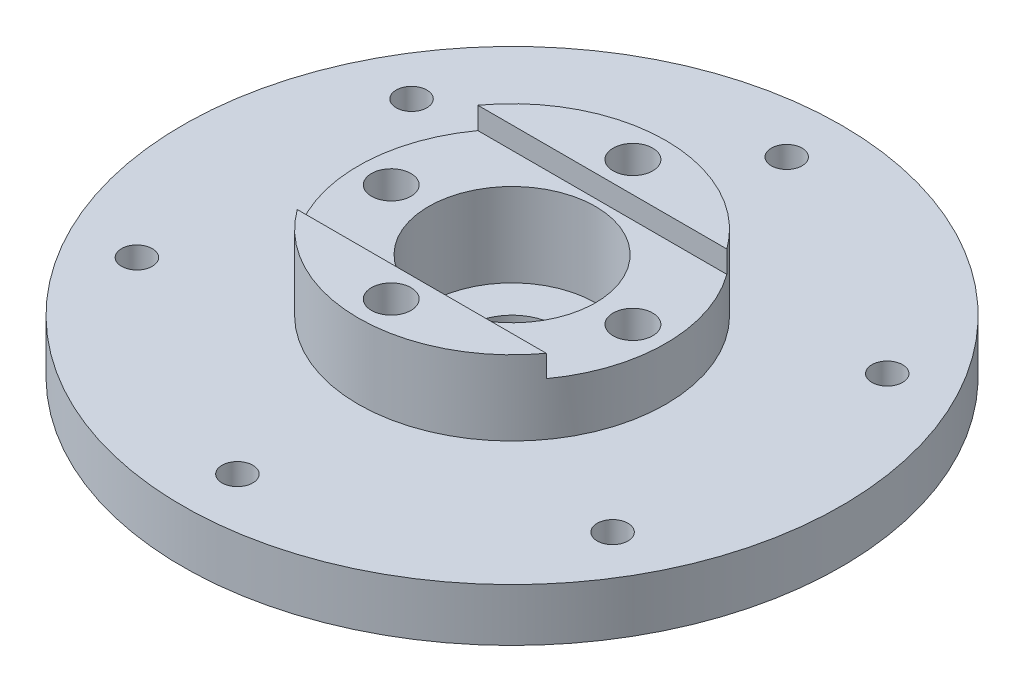
ISO-10303-21;
HEADER;
FILE_DESCRIPTION(('STEP AP214'),'2;1');
FILE_NAME('part.step','',(''),(''),'','','');
FILE_SCHEMA(('AUTOMOTIVE_DESIGN { 1 0 10303 214 1 1 1 1 }'));
ENDSEC;
DATA;
#1=APPLICATION_CONTEXT('core data for automotive mechanical design processes');
#2=APPLICATION_PROTOCOL_DEFINITION('international standard','automotive_design',2000,#1);
#3=PRODUCT_CONTEXT('',#1,'mechanical');
#4=PRODUCT('Part','Part','',(#3));
#5=PRODUCT_RELATED_PRODUCT_CATEGORY('part','',(#4));
#6=PRODUCT_DEFINITION_FORMATION('','',#4);
#7=PRODUCT_DEFINITION_CONTEXT('part definition',#1,'design');
#8=PRODUCT_DEFINITION('design','',#6,#7);
#9=PRODUCT_DEFINITION_SHAPE('','',#8);
#10=(LENGTH_UNIT() NAMED_UNIT(*) SI_UNIT(.MILLI.,.METRE.));
#11=(NAMED_UNIT(*) PLANE_ANGLE_UNIT() SI_UNIT($,.RADIAN.));
#12=(NAMED_UNIT(*) SI_UNIT($,.STERADIAN.) SOLID_ANGLE_UNIT());
#13=UNCERTAINTY_MEASURE_WITH_UNIT(LENGTH_MEASURE(1.E-05),#10,'distance_accuracy_value','');
#14=(GEOMETRIC_REPRESENTATION_CONTEXT(3) GLOBAL_UNCERTAINTY_ASSIGNED_CONTEXT((#13)) GLOBAL_UNIT_ASSIGNED_CONTEXT((#10,
#11,#12)) REPRESENTATION_CONTEXT('',''));
#15=CARTESIAN_POINT('',(0.,0.,0.));
#16=DIRECTION('',(0.,0.,1.));
#17=DIRECTION('',(1.,0.,0.));
#18=AXIS2_PLACEMENT_3D('',#15,#16,#17);
#19=CARTESIAN_POINT('',(-35.,29.,0.));
#20=DIRECTION('',(0.,-1.,0.));
#21=DIRECTION('',(0.,0.,-1.));
#22=AXIS2_PLACEMENT_3D('',#19,#20,#21);
#23=PLANE('',#22);
#24=CARTESIAN_POINT('',(0.,29.,-27.5));
#25=DIRECTION('',(0.,-1.,0.));
#26=DIRECTION('',(0.,0.,-1.));
#27=AXIS2_PLACEMENT_3D('',#24,#25,#26);
#28=CIRCLE('',#27,4.5);
#29=CARTESIAN_POINT('',(0.,29.,-32.));
#30=VERTEX_POINT('',#29);
#31=EDGE_CURVE('E132',#30,#30,#28,.T.);
#32=ORIENTED_EDGE('',*,*,#31,.T.);
#33=EDGE_LOOP('',(#32));
#34=FACE_BOUND('',#33,.T.);
#35=CARTESIAN_POINT('',(0.,29.,0.));
#36=DIRECTION('',(0.,-1.,0.));
#37=DIRECTION('',(0.,0.,-1.));
#38=AXIS2_PLACEMENT_3D('',#35,#36,#37);
#39=CIRCLE('',#38,35.);
#40=CARTESIAN_POINT('',(-28.3319166312482,29.,-20.55));
#41=VERTEX_POINT('',#40);
#42=CARTESIAN_POINT('',(28.3319166312482,29.,-20.55));
#43=VERTEX_POINT('',#42);
#44=EDGE_CURVE('E92',#41,#43,#39,.T.);
#45=ORIENTED_EDGE('',*,*,#44,.F.);
#46=DIRECTION('',(1.,0.,0.));
#47=VECTOR('',#46,1.);
#48=CARTESIAN_POINT('',(-60.,29.,-20.55));
#49=LINE('',#48,#47);
#50=EDGE_CURVE('E80',#41,#43,#49,.T.);
#51=ORIENTED_EDGE('',*,*,#50,.T.);
#52=EDGE_LOOP('',(#45,#51));
#53=FACE_BOUND('',#52,.T.);
#54=ADVANCED_FACE('F36',(#34,#53),#23,.F.);
#55=CARTESIAN_POINT('',(0.,0.,0.));
#56=DIRECTION('',(0.,-1.,0.));
#57=DIRECTION('',(0.,0.,-1.));
#58=AXIS2_PLACEMENT_3D('',#55,#56,#57);
#59=CYLINDRICAL_SURFACE('',#58,19.);
#60=CARTESIAN_POINT('',(0.,24.,0.));
#61=DIRECTION('',(0.,-1.,0.));
#62=DIRECTION('',(0.,0.,-1.));
#63=AXIS2_PLACEMENT_3D('',#60,#61,#62);
#64=CIRCLE('',#63,19.);
#65=CARTESIAN_POINT('',(0.,24.,-19.));
#66=VERTEX_POINT('',#65);
#67=EDGE_CURVE('E141',#66,#66,#64,.F.);
#68=ORIENTED_EDGE('',*,*,#67,.T.);
#69=EDGE_LOOP('',(#68));
#70=FACE_BOUND('',#69,.T.);
#71=CARTESIAN_POINT('',(0.,5.,0.));
#72=DIRECTION('',(0.,-1.,0.));
#73=DIRECTION('',(0.,0.,-1.));
#74=AXIS2_PLACEMENT_3D('',#71,#72,#73);
#75=CIRCLE('',#74,19.);
#76=CARTESIAN_POINT('',(0.,5.,-19.));
#77=VERTEX_POINT('',#76);
#78=EDGE_CURVE('E147',#77,#77,#75,.T.);
#79=ORIENTED_EDGE('',*,*,#78,.T.);
#80=EDGE_LOOP('',(#79));
#81=FACE_BOUND('',#80,.T.);
#82=ADVANCED_FACE('F38',(#70,#81),#59,.F.);
#83=CARTESIAN_POINT('',(0.,29.,27.5));
#84=DIRECTION('',(0.,-1.,0.));
#85=DIRECTION('',(0.,0.,-1.));
#86=AXIS2_PLACEMENT_3D('',#83,#84,#85);
#87=CIRCLE('',#86,4.5);
#88=CARTESIAN_POINT('',(0.,29.,23.));
#89=VERTEX_POINT('',#88);
#90=EDGE_CURVE('E118',#89,#89,#87,.T.);
#91=ORIENTED_EDGE('',*,*,#90,.T.);
#92=EDGE_LOOP('',(#91));
#93=FACE_BOUND('',#92,.T.);
#94=CARTESIAN_POINT('',(28.3319166312482,29.,20.55));
#95=VERTEX_POINT('',#94);
#96=CARTESIAN_POINT('',(-28.3319166312482,29.,20.55));
#97=VERTEX_POINT('',#96);
#98=EDGE_CURVE('E94',#95,#97,#39,.T.);
#99=ORIENTED_EDGE('',*,*,#98,.F.);
#100=DIRECTION('',(1.,0.,0.));
#101=VECTOR('',#100,1.);
#102=CARTESIAN_POINT('',(-60.,29.,20.55));
#103=LINE('',#102,#101);
#104=EDGE_CURVE('E53',#97,#95,#103,.T.);
#105=ORIENTED_EDGE('',*,*,#104,.F.);
#106=EDGE_LOOP('',(#99,#105));
#107=FACE_BOUND('',#106,.T.);
#108=ADVANCED_FACE('F171',(#93,#107),#23,.F.);
#109=CARTESIAN_POINT('',(0.,0.,0.));
#110=DIRECTION('',(0.,-1.,0.));
#111=DIRECTION('',(0.,0.,-1.));
#112=AXIS2_PLACEMENT_3D('',#109,#110,#111);
#113=CYLINDRICAL_SURFACE('',#112,35.);
#114=CARTESIAN_POINT('',(0.,12.,0.));
#115=DIRECTION('',(0.,-1.,0.));
#116=DIRECTION('',(0.,0.,-1.));
#117=AXIS2_PLACEMENT_3D('',#114,#115,#116);
#118=CIRCLE('',#117,35.);
#119=CARTESIAN_POINT('',(0.,12.,-35.));
#120=VERTEX_POINT('',#119);
#121=EDGE_CURVE('E95',#120,#120,#118,.T.);
#122=ORIENTED_EDGE('',*,*,#121,.F.);
#123=EDGE_LOOP('',(#122));
#124=FACE_BOUND('',#123,.T.);
#125=CARTESIAN_POINT('',(0.,24.,0.));
#126=DIRECTION('',(0.,-1.,0.));
#127=DIRECTION('',(0.,0.,-1.));
#128=AXIS2_PLACEMENT_3D('',#125,#126,#127);
#129=CIRCLE('',#128,35.);
#130=CARTESIAN_POINT('',(-28.3319166312483,24.,20.55));
#131=VERTEX_POINT('',#130);
#132=CARTESIAN_POINT('',(-28.3319166312482,24.,-20.55));
#133=VERTEX_POINT('',#132);
#134=EDGE_CURVE('E45',#131,#133,#129,.T.);
#135=ORIENTED_EDGE('',*,*,#134,.T.);
#136=DIRECTION('',(0.,-1.,0.));
#137=VECTOR('',#136,1.);
#138=CARTESIAN_POINT('',(-28.3319166312482,0.,-20.55));
#139=LINE('',#138,#137);
#140=EDGE_CURVE('E11',#133,#41,#139,.F.);
#141=ORIENTED_EDGE('',*,*,#140,.T.);
#142=ORIENTED_EDGE('',*,*,#44,.T.);
#143=DIRECTION('',(0.,-1.,0.));
#144=VECTOR('',#143,1.);
#145=CARTESIAN_POINT('',(28.3319166312482,0.,-20.55));
#146=LINE('',#145,#144);
#147=CARTESIAN_POINT('',(28.3319166312482,24.,-20.55));
#148=VERTEX_POINT('',#147);
#149=EDGE_CURVE('E83',#43,#148,#146,.T.);
#150=ORIENTED_EDGE('',*,*,#149,.T.);
#151=CARTESIAN_POINT('',(28.3319166312482,24.,20.55));
#152=VERTEX_POINT('',#151);
#153=EDGE_CURVE('E61',#148,#152,#129,.T.);
#154=ORIENTED_EDGE('',*,*,#153,.T.);
#155=DIRECTION('',(0.,-1.,0.));
#156=VECTOR('',#155,1.);
#157=CARTESIAN_POINT('',(28.3319166312482,0.,20.55));
#158=LINE('',#157,#156);
#159=EDGE_CURVE('E98',#152,#95,#158,.F.);
#160=ORIENTED_EDGE('',*,*,#159,.T.);
#161=ORIENTED_EDGE('',*,*,#98,.T.);
#162=DIRECTION('',(0.,-1.,0.));
#163=VECTOR('',#162,1.);
#164=CARTESIAN_POINT('',(-28.3319166312482,0.,20.55));
#165=LINE('',#164,#163);
#166=EDGE_CURVE('E107',#97,#131,#165,.T.);
#167=ORIENTED_EDGE('',*,*,#166,.T.);
#168=EDGE_LOOP('',(#135,#141,#142,#150,#154,#160,#161,#167));
#169=FACE_BOUND('',#168,.T.);
#170=ADVANCED_FACE('F91',(#124,#169),#113,.T.);
#171=CARTESIAN_POINT('',(-75.,12.,0.));
#172=DIRECTION('',(0.,-1.,0.));
#173=DIRECTION('',(0.,0.,-1.));
#174=AXIS2_PLACEMENT_3D('',#171,#172,#173);
#175=PLANE('',#174);
#176=CARTESIAN_POINT('',(54.126587736527,12.,31.2500000000006));
#177=DIRECTION('',(0.,1.,0.));
#178=DIRECTION('',(0.866025403784433,0.,0.50000000000001));
#179=AXIS2_PLACEMENT_3D('',#176,#177,#178);
#180=CIRCLE('',#179,3.5);
#181=CARTESIAN_POINT('',(57.1576766497726,12.,33.0000000000007));
#182=VERTEX_POINT('',#181);
#183=EDGE_CURVE('E262',#182,#182,#180,.T.);
#184=ORIENTED_EDGE('',*,*,#183,.F.);
#185=EDGE_LOOP('',(#184));
#186=FACE_BOUND('',#185,.T.);
#187=CARTESIAN_POINT('',(54.1265877365277,12.,-31.2499999999995));
#188=DIRECTION('',(0.,1.,0.));
#189=DIRECTION('',(0.866025403784443,0.,-0.499999999999992));
#190=AXIS2_PLACEMENT_3D('',#187,#188,#189);
#191=CIRCLE('',#190,3.5);
#192=CARTESIAN_POINT('',(57.1576766497733,12.,-32.9999999999995));
#193=VERTEX_POINT('',#192);
#194=EDGE_CURVE('E266',#193,#193,#191,.T.);
#195=ORIENTED_EDGE('',*,*,#194,.F.);
#196=EDGE_LOOP('',(#195));
#197=FACE_BOUND('',#196,.T.);
#198=CARTESIAN_POINT('',(0.,12.,-62.5));
#199=DIRECTION('',(0.,1.,0.));
#200=DIRECTION('',(0.,0.,-1.));
#201=AXIS2_PLACEMENT_3D('',#198,#199,#200);
#202=CIRCLE('',#201,3.5);
#203=CARTESIAN_POINT('',(0.,12.,-66.));
#204=VERTEX_POINT('',#203);
#205=EDGE_CURVE('E275',#204,#204,#202,.T.);
#206=ORIENTED_EDGE('',*,*,#205,.F.);
#207=EDGE_LOOP('',(#206));
#208=FACE_BOUND('',#207,.T.);
#209=CARTESIAN_POINT('',(-54.1265877365273,12.,-31.2500000000003));
#210=DIRECTION('',(0.,1.,0.));
#211=DIRECTION('',(-0.866025403784436,0.,-0.500000000000004));
#212=AXIS2_PLACEMENT_3D('',#209,#210,#211);
#213=CIRCLE('',#212,3.5);
#214=CARTESIAN_POINT('',(-57.1576766497728,12.,-33.0000000000003));
#215=VERTEX_POINT('',#214);
#216=EDGE_CURVE('E281',#215,#215,#213,.T.);
#217=ORIENTED_EDGE('',*,*,#216,.F.);
#218=EDGE_LOOP('',(#217));
#219=FACE_BOUND('',#218,.T.);
#220=CARTESIAN_POINT('',(-54.1265877365275,12.,31.2499999999999));
#221=DIRECTION('',(0.,1.,0.));
#222=DIRECTION('',(-0.86602540378444,0.,0.499999999999998));
#223=AXIS2_PLACEMENT_3D('',#220,#221,#222);
#224=CIRCLE('',#223,3.5);
#225=CARTESIAN_POINT('',(-57.157676649773,12.,32.9999999999999));
#226=VERTEX_POINT('',#225);
#227=EDGE_CURVE('E287',#226,#226,#224,.T.);
#228=ORIENTED_EDGE('',*,*,#227,.F.);
#229=EDGE_LOOP('',(#228));
#230=FACE_BOUND('',#229,.T.);
#231=CARTESIAN_POINT('',(0.,12.,62.5));
#232=DIRECTION('',(0.,1.,0.));
#233=DIRECTION('',(0.,0.,1.));
#234=AXIS2_PLACEMENT_3D('',#231,#232,#233);
#235=CIRCLE('',#234,3.5);
#236=CARTESIAN_POINT('',(0.,12.,66.));
#237=VERTEX_POINT('',#236);
#238=EDGE_CURVE('E125',#237,#237,#235,.T.);
#239=ORIENTED_EDGE('',*,*,#238,.F.);
#240=EDGE_LOOP('',(#239));
#241=FACE_BOUND('',#240,.T.);
#242=CARTESIAN_POINT('',(0.,12.,0.));
#243=DIRECTION('',(0.,-1.,0.));
#244=DIRECTION('',(0.,0.,-1.));
#245=AXIS2_PLACEMENT_3D('',#242,#243,#244);
#246=CIRCLE('',#245,75.);
#247=CARTESIAN_POINT('',(0.,12.,-75.));
#248=VERTEX_POINT('',#247);
#249=EDGE_CURVE('E100',#248,#248,#246,.T.);
#250=ORIENTED_EDGE('',*,*,#249,.F.);
#251=EDGE_LOOP('',(#250));
#252=FACE_BOUND('',#251,.T.);
#253=ORIENTED_EDGE('',*,*,#121,.T.);
#254=EDGE_LOOP('',(#253));
#255=FACE_BOUND('',#254,.T.);
#256=ADVANCED_FACE('F163',(#186,#197,#208,#219,#230,#241,#252,#255),#175,.F.);
#257=CARTESIAN_POINT('',(0.,0.,0.));
#258=DIRECTION('',(0.,-1.,0.));
#259=DIRECTION('',(0.,0.,-1.));
#260=AXIS2_PLACEMENT_3D('',#257,#258,#259);
#261=CYLINDRICAL_SURFACE('',#260,75.);
#262=CARTESIAN_POINT('',(0.,0.,0.));
#263=DIRECTION('',(0.,-1.,0.));
#264=DIRECTION('',(0.,0.,-1.));
#265=AXIS2_PLACEMENT_3D('',#262,#263,#264);
#266=CIRCLE('',#265,75.);
#267=CARTESIAN_POINT('',(0.,0.,-75.));
#268=VERTEX_POINT('',#267);
#269=EDGE_CURVE('E156',#268,#268,#266,.T.);
#270=ORIENTED_EDGE('',*,*,#269,.F.);
#271=EDGE_LOOP('',(#270));
#272=FACE_BOUND('',#271,.T.);
#273=ORIENTED_EDGE('',*,*,#249,.T.);
#274=EDGE_LOOP('',(#273));
#275=FACE_BOUND('',#274,.T.);
#276=ADVANCED_FACE('F161',(#272,#275),#261,.T.);
#277=CARTESIAN_POINT('',(-10.,0.,0.));
#278=DIRECTION('',(0.,1.,0.));
#279=DIRECTION('',(0.,0.,1.));
#280=AXIS2_PLACEMENT_3D('',#277,#278,#279);
#281=PLANE('',#280);
#282=CARTESIAN_POINT('',(54.126587736527,0.,31.2500000000006));
#283=DIRECTION('',(0.,1.,0.));
#284=DIRECTION('',(0.866025403784433,0.,0.50000000000001));
#285=AXIS2_PLACEMENT_3D('',#282,#283,#284);
#286=CIRCLE('',#285,3.5);
#287=CARTESIAN_POINT('',(57.1576766497726,0.,33.0000000000007));
#288=VERTEX_POINT('',#287);
#289=EDGE_CURVE('E265',#288,#288,#286,.T.);
#290=ORIENTED_EDGE('',*,*,#289,.T.);
#291=EDGE_LOOP('',(#290));
#292=FACE_BOUND('',#291,.T.);
#293=CARTESIAN_POINT('',(54.1265877365277,0.,-31.2499999999995));
#294=DIRECTION('',(0.,1.,0.));
#295=DIRECTION('',(0.866025403784443,0.,-0.499999999999992));
#296=AXIS2_PLACEMENT_3D('',#293,#294,#295);
#297=CIRCLE('',#296,3.5);
#298=CARTESIAN_POINT('',(57.1576766497733,0.,-32.9999999999995));
#299=VERTEX_POINT('',#298);
#300=EDGE_CURVE('E269',#299,#299,#297,.T.);
#301=ORIENTED_EDGE('',*,*,#300,.T.);
#302=EDGE_LOOP('',(#301));
#303=FACE_BOUND('',#302,.T.);
#304=CARTESIAN_POINT('',(0.,0.,-62.5));
#305=DIRECTION('',(0.,1.,0.));
#306=DIRECTION('',(0.,0.,-1.));
#307=AXIS2_PLACEMENT_3D('',#304,#305,#306);
#308=CIRCLE('',#307,3.5);
#309=CARTESIAN_POINT('',(0.,0.,-66.));
#310=VERTEX_POINT('',#309);
#311=EDGE_CURVE('E278',#310,#310,#308,.T.);
#312=ORIENTED_EDGE('',*,*,#311,.T.);
#313=EDGE_LOOP('',(#312));
#314=FACE_BOUND('',#313,.T.);
#315=CARTESIAN_POINT('',(-54.1265877365273,0.,-31.2500000000003));
#316=DIRECTION('',(0.,1.,0.));
#317=DIRECTION('',(-0.866025403784436,0.,-0.500000000000004));
#318=AXIS2_PLACEMENT_3D('',#315,#316,#317);
#319=CIRCLE('',#318,3.5);
#320=CARTESIAN_POINT('',(-57.1576766497728,0.,-33.0000000000003));
#321=VERTEX_POINT('',#320);
#322=EDGE_CURVE('E284',#321,#321,#319,.T.);
#323=ORIENTED_EDGE('',*,*,#322,.T.);
#324=EDGE_LOOP('',(#323));
#325=FACE_BOUND('',#324,.T.);
#326=CARTESIAN_POINT('',(-54.1265877365275,0.,31.2499999999999));
#327=DIRECTION('',(0.,1.,0.));
#328=DIRECTION('',(-0.86602540378444,0.,0.499999999999998));
#329=AXIS2_PLACEMENT_3D('',#326,#327,#328);
#330=CIRCLE('',#329,3.5);
#331=CARTESIAN_POINT('',(-57.157676649773,0.,32.9999999999999));
#332=VERTEX_POINT('',#331);
#333=EDGE_CURVE('E289',#332,#332,#330,.T.);
#334=ORIENTED_EDGE('',*,*,#333,.T.);
#335=EDGE_LOOP('',(#334));
#336=FACE_BOUND('',#335,.T.);
#337=CARTESIAN_POINT('',(0.,0.,62.5));
#338=DIRECTION('',(0.,1.,0.));
#339=DIRECTION('',(0.,0.,1.));
#340=AXIS2_PLACEMENT_3D('',#337,#338,#339);
#341=CIRCLE('',#340,3.5);
#342=CARTESIAN_POINT('',(0.,0.,66.));
#343=VERTEX_POINT('',#342);
#344=EDGE_CURVE('E40',#343,#343,#341,.T.);
#345=ORIENTED_EDGE('',*,*,#344,.T.);
#346=EDGE_LOOP('',(#345));
#347=FACE_BOUND('',#346,.T.);
#348=CARTESIAN_POINT('',(27.5,0.,0.));
#349=DIRECTION('',(0.,-1.,0.));
#350=DIRECTION('',(0.,0.,-1.));
#351=AXIS2_PLACEMENT_3D('',#348,#349,#350);
#352=CIRCLE('',#351,4.5);
#353=CARTESIAN_POINT('',(27.5,0.,-4.5));
#354=VERTEX_POINT('',#353);
#355=EDGE_CURVE('E114',#354,#354,#352,.T.);
#356=ORIENTED_EDGE('',*,*,#355,.F.);
#357=EDGE_LOOP('',(#356));
#358=FACE_BOUND('',#357,.T.);
#359=CARTESIAN_POINT('',(0.,0.,27.5));
#360=DIRECTION('',(0.,-1.,0.));
#361=DIRECTION('',(0.,0.,-1.));
#362=AXIS2_PLACEMENT_3D('',#359,#360,#361);
#363=CIRCLE('',#362,4.5);
#364=CARTESIAN_POINT('',(0.,0.,23.));
#365=VERTEX_POINT('',#364);
#366=EDGE_CURVE('E113',#365,#365,#363,.T.);
#367=ORIENTED_EDGE('',*,*,#366,.F.);
#368=EDGE_LOOP('',(#367));
#369=FACE_BOUND('',#368,.T.);
#370=CARTESIAN_POINT('',(0.,0.,-27.5));
#371=DIRECTION('',(0.,-1.,0.));
#372=DIRECTION('',(0.,0.,-1.));
#373=AXIS2_PLACEMENT_3D('',#370,#371,#372);
#374=CIRCLE('',#373,4.5);
#375=CARTESIAN_POINT('',(0.,0.,-32.));
#376=VERTEX_POINT('',#375);
#377=EDGE_CURVE('E130',#376,#376,#374,.T.);
#378=ORIENTED_EDGE('',*,*,#377,.F.);
#379=EDGE_LOOP('',(#378));
#380=FACE_BOUND('',#379,.T.);
#381=CARTESIAN_POINT('',(-27.5,0.,0.));
#382=DIRECTION('',(0.,-1.,0.));
#383=DIRECTION('',(0.,0.,-1.));
#384=AXIS2_PLACEMENT_3D('',#381,#382,#383);
#385=CIRCLE('',#384,4.5);
#386=CARTESIAN_POINT('',(-27.5,0.,-4.5));
#387=VERTEX_POINT('',#386);
#388=EDGE_CURVE('E110',#387,#387,#385,.T.);
#389=ORIENTED_EDGE('',*,*,#388,.F.);
#390=EDGE_LOOP('',(#389));
#391=FACE_BOUND('',#390,.T.);
#392=CARTESIAN_POINT('',(0.,0.,0.));
#393=DIRECTION('',(0.,-1.,0.));
#394=DIRECTION('',(0.,0.,-1.));
#395=AXIS2_PLACEMENT_3D('',#392,#393,#394);
#396=CIRCLE('',#395,10.);
#397=CARTESIAN_POINT('',(0.,0.,-10.));
#398=VERTEX_POINT('',#397);
#399=EDGE_CURVE('E153',#398,#398,#396,.T.);
#400=ORIENTED_EDGE('',*,*,#399,.F.);
#401=EDGE_LOOP('',(#400));
#402=FACE_BOUND('',#401,.T.);
#403=ORIENTED_EDGE('',*,*,#269,.T.);
#404=EDGE_LOOP('',(#403));
#405=FACE_BOUND('',#404,.T.);
#406=ADVANCED_FACE('F193',(#292,#303,#314,#325,#336,#347,#358,#369,#380,#391,#402,#405),#281,.F.);
#407=CARTESIAN_POINT('',(0.,0.,0.));
#408=DIRECTION('',(0.,-1.,0.));
#409=DIRECTION('',(0.,0.,-1.));
#410=AXIS2_PLACEMENT_3D('',#407,#408,#409);
#411=CYLINDRICAL_SURFACE('',#410,10.);
#412=CARTESIAN_POINT('',(0.,5.,0.));
#413=DIRECTION('',(0.,-1.,0.));
#414=DIRECTION('',(0.,0.,-1.));
#415=AXIS2_PLACEMENT_3D('',#412,#413,#414);
#416=CIRCLE('',#415,10.);
#417=CARTESIAN_POINT('',(0.,5.,-10.));
#418=VERTEX_POINT('',#417);
#419=EDGE_CURVE('E150',#418,#418,#416,.T.);
#420=ORIENTED_EDGE('',*,*,#419,.F.);
#421=EDGE_LOOP('',(#420));
#422=FACE_BOUND('',#421,.T.);
#423=ORIENTED_EDGE('',*,*,#399,.T.);
#424=EDGE_LOOP('',(#423));
#425=FACE_BOUND('',#424,.T.);
#426=ADVANCED_FACE('F196',(#422,#425),#411,.F.);
#427=CARTESIAN_POINT('',(-19.,5.,0.));
#428=DIRECTION('',(0.,-1.,0.));
#429=DIRECTION('',(0.,0.,-1.));
#430=AXIS2_PLACEMENT_3D('',#427,#428,#429);
#431=PLANE('',#430);
#432=ORIENTED_EDGE('',*,*,#78,.F.);
#433=EDGE_LOOP('',(#432));
#434=FACE_BOUND('',#433,.T.);
#435=ORIENTED_EDGE('',*,*,#419,.T.);
#436=EDGE_LOOP('',(#435));
#437=FACE_BOUND('',#436,.T.);
#438=ADVANCED_FACE('F212',(#434,#437),#431,.F.);
#439=CARTESIAN_POINT('',(-60.,24.,-20.55));
#440=DIRECTION('',(0.,0.,-1.));
#441=DIRECTION('',(-1.,0.,0.));
#442=AXIS2_PLACEMENT_3D('',#439,#440,#441);
#443=PLANE('',#442);
#444=ORIENTED_EDGE('',*,*,#50,.F.);
#445=ORIENTED_EDGE('',*,*,#140,.F.);
#446=DIRECTION('',(1.,0.,0.));
#447=VECTOR('',#446,1.);
#448=CARTESIAN_POINT('',(-60.,24.,-20.55));
#449=LINE('',#448,#447);
#450=EDGE_CURVE('E139',#133,#148,#449,.T.);
#451=ORIENTED_EDGE('',*,*,#450,.T.);
#452=ORIENTED_EDGE('',*,*,#149,.F.);
#453=EDGE_LOOP('',(#444,#445,#451,#452));
#454=FACE_BOUND('',#453,.T.);
#455=ADVANCED_FACE('F81',(#454),#443,.F.);
#456=CARTESIAN_POINT('',(-60.,24.,20.55));
#457=DIRECTION('',(0.,-1.,0.));
#458=DIRECTION('',(0.,0.,-1.));
#459=AXIS2_PLACEMENT_3D('',#456,#457,#458);
#460=PLANE('',#459);
#461=CARTESIAN_POINT('',(27.5,24.,0.));
#462=DIRECTION('',(0.,-1.,0.));
#463=DIRECTION('',(0.,0.,-1.));
#464=AXIS2_PLACEMENT_3D('',#461,#462,#463);
#465=CIRCLE('',#464,4.5);
#466=CARTESIAN_POINT('',(27.5,24.,-4.5));
#467=VERTEX_POINT('',#466);
#468=EDGE_CURVE('E111',#467,#467,#465,.T.);
#469=ORIENTED_EDGE('',*,*,#468,.T.);
#470=EDGE_LOOP('',(#469));
#471=FACE_BOUND('',#470,.T.);
#472=CARTESIAN_POINT('',(-27.5,24.,0.));
#473=DIRECTION('',(0.,-1.,0.));
#474=DIRECTION('',(0.,0.,-1.));
#475=AXIS2_PLACEMENT_3D('',#472,#473,#474);
#476=CIRCLE('',#475,4.5);
#477=CARTESIAN_POINT('',(-27.5,24.,-4.5));
#478=VERTEX_POINT('',#477);
#479=EDGE_CURVE('E87',#478,#478,#476,.T.);
#480=ORIENTED_EDGE('',*,*,#479,.T.);
#481=EDGE_LOOP('',(#480));
#482=FACE_BOUND('',#481,.T.);
#483=ORIENTED_EDGE('',*,*,#450,.F.);
#484=ORIENTED_EDGE('',*,*,#134,.F.);
#485=DIRECTION('',(1.,0.,0.));
#486=VECTOR('',#485,1.);
#487=CARTESIAN_POINT('',(-60.,24.,20.55));
#488=LINE('',#487,#486);
#489=EDGE_CURVE('E142',#131,#152,#488,.T.);
#490=ORIENTED_EDGE('',*,*,#489,.T.);
#491=ORIENTED_EDGE('',*,*,#153,.F.);
#492=EDGE_LOOP('',(#483,#484,#490,#491));
#493=FACE_BOUND('',#492,.T.);
#494=ORIENTED_EDGE('',*,*,#67,.F.);
#495=EDGE_LOOP('',(#494));
#496=FACE_BOUND('',#495,.T.);
#497=ADVANCED_FACE('F219',(#471,#482,#493,#496),#460,.F.);
#498=CARTESIAN_POINT('',(-60.,24.,20.55));
#499=DIRECTION('',(0.,0.,1.));
#500=DIRECTION('',(1.,0.,0.));
#501=AXIS2_PLACEMENT_3D('',#498,#499,#500);
#502=PLANE('',#501);
#503=ORIENTED_EDGE('',*,*,#104,.T.);
#504=ORIENTED_EDGE('',*,*,#159,.F.);
#505=ORIENTED_EDGE('',*,*,#489,.F.);
#506=ORIENTED_EDGE('',*,*,#166,.F.);
#507=EDGE_LOOP('',(#503,#504,#505,#506));
#508=FACE_BOUND('',#507,.T.);
#509=ADVANCED_FACE('F220',(#508),#502,.F.);
#510=CARTESIAN_POINT('',(-27.5,29.,0.));
#511=DIRECTION('',(0.,-1.,0.));
#512=DIRECTION('',(0.,0.,-1.));
#513=AXIS2_PLACEMENT_3D('',#510,#511,#512);
#514=CYLINDRICAL_SURFACE('',#513,4.5);
#515=ORIENTED_EDGE('',*,*,#388,.T.);
#516=EDGE_LOOP('',(#515));
#517=FACE_BOUND('',#516,.T.);
#518=ORIENTED_EDGE('',*,*,#479,.F.);
#519=EDGE_LOOP('',(#518));
#520=FACE_BOUND('',#519,.T.);
#521=ADVANCED_FACE('F189',(#517,#520),#514,.F.);
#522=CARTESIAN_POINT('',(0.,29.,-27.5));
#523=DIRECTION('',(0.,-1.,0.));
#524=DIRECTION('',(0.,0.,-1.));
#525=AXIS2_PLACEMENT_3D('',#522,#523,#524);
#526=CYLINDRICAL_SURFACE('',#525,4.5);
#527=ORIENTED_EDGE('',*,*,#31,.F.);
#528=EDGE_LOOP('',(#527));
#529=FACE_BOUND('',#528,.T.);
#530=ORIENTED_EDGE('',*,*,#377,.T.);
#531=EDGE_LOOP('',(#530));
#532=FACE_BOUND('',#531,.T.);
#533=ADVANCED_FACE('F185',(#529,#532),#526,.F.);
#534=CARTESIAN_POINT('',(0.,29.,27.5));
#535=DIRECTION('',(0.,-1.,0.));
#536=DIRECTION('',(0.,0.,-1.));
#537=AXIS2_PLACEMENT_3D('',#534,#535,#536);
#538=CYLINDRICAL_SURFACE('',#537,4.5);
#539=ORIENTED_EDGE('',*,*,#90,.F.);
#540=EDGE_LOOP('',(#539));
#541=FACE_BOUND('',#540,.T.);
#542=ORIENTED_EDGE('',*,*,#366,.T.);
#543=EDGE_LOOP('',(#542));
#544=FACE_BOUND('',#543,.T.);
#545=ADVANCED_FACE('F188',(#541,#544),#538,.F.);
#546=CARTESIAN_POINT('',(27.5,29.,0.));
#547=DIRECTION('',(0.,-1.,0.));
#548=DIRECTION('',(0.,0.,-1.));
#549=AXIS2_PLACEMENT_3D('',#546,#547,#548);
#550=CYLINDRICAL_SURFACE('',#549,4.5);
#551=ORIENTED_EDGE('',*,*,#355,.T.);
#552=EDGE_LOOP('',(#551));
#553=FACE_BOUND('',#552,.T.);
#554=ORIENTED_EDGE('',*,*,#468,.F.);
#555=EDGE_LOOP('',(#554));
#556=FACE_BOUND('',#555,.T.);
#557=ADVANCED_FACE('F230',(#553,#556),#550,.F.);
#558=CARTESIAN_POINT('',(0.,12.,62.5));
#559=DIRECTION('',(0.,1.,0.));
#560=DIRECTION('',(0.,0.,1.));
#561=AXIS2_PLACEMENT_3D('',#558,#559,#560);
#562=CYLINDRICAL_SURFACE('',#561,3.5);
#563=ORIENTED_EDGE('',*,*,#238,.T.);
#564=EDGE_LOOP('',(#563));
#565=FACE_BOUND('',#564,.T.);
#566=ORIENTED_EDGE('',*,*,#344,.F.);
#567=EDGE_LOOP('',(#566));
#568=FACE_BOUND('',#567,.T.);
#569=ADVANCED_FACE('F234',(#565,#568),#562,.F.);
#570=CARTESIAN_POINT('',(-54.1265877365275,12.,31.2499999999999));
#571=DIRECTION('',(0.,1.,0.));
#572=DIRECTION('',(-0.86602540378444,0.,0.499999999999998));
#573=AXIS2_PLACEMENT_3D('',#570,#571,#572);
#574=CYLINDRICAL_SURFACE('',#573,3.5);
#575=ORIENTED_EDGE('',*,*,#227,.T.);
#576=EDGE_LOOP('',(#575));
#577=FACE_BOUND('',#576,.T.);
#578=ORIENTED_EDGE('',*,*,#333,.F.);
#579=EDGE_LOOP('',(#578));
#580=FACE_BOUND('',#579,.T.);
#581=ADVANCED_FACE('F237',(#577,#580),#574,.F.);
#582=CARTESIAN_POINT('',(-54.1265877365273,12.,-31.2500000000003));
#583=DIRECTION('',(0.,1.,0.));
#584=DIRECTION('',(-0.866025403784436,0.,-0.500000000000004));
#585=AXIS2_PLACEMENT_3D('',#582,#583,#584);
#586=CYLINDRICAL_SURFACE('',#585,3.5);
#587=ORIENTED_EDGE('',*,*,#216,.T.);
#588=EDGE_LOOP('',(#587));
#589=FACE_BOUND('',#588,.T.);
#590=ORIENTED_EDGE('',*,*,#322,.F.);
#591=EDGE_LOOP('',(#590));
#592=FACE_BOUND('',#591,.T.);
#593=ADVANCED_FACE('F241',(#589,#592),#586,.F.);
#594=CARTESIAN_POINT('',(0.,12.,-62.5));
#595=DIRECTION('',(0.,1.,0.));
#596=DIRECTION('',(0.,0.,-1.));
#597=AXIS2_PLACEMENT_3D('',#594,#595,#596);
#598=CYLINDRICAL_SURFACE('',#597,3.5);
#599=ORIENTED_EDGE('',*,*,#205,.T.);
#600=EDGE_LOOP('',(#599));
#601=FACE_BOUND('',#600,.T.);
#602=ORIENTED_EDGE('',*,*,#311,.F.);
#603=EDGE_LOOP('',(#602));
#604=FACE_BOUND('',#603,.T.);
#605=ADVANCED_FACE('F245',(#601,#604),#598,.F.);
#606=CARTESIAN_POINT('',(54.1265877365277,12.,-31.2499999999995));
#607=DIRECTION('',(0.,1.,0.));
#608=DIRECTION('',(0.866025403784443,0.,-0.499999999999992));
#609=AXIS2_PLACEMENT_3D('',#606,#607,#608);
#610=CYLINDRICAL_SURFACE('',#609,3.5);
#611=ORIENTED_EDGE('',*,*,#194,.T.);
#612=EDGE_LOOP('',(#611));
#613=FACE_BOUND('',#612,.T.);
#614=ORIENTED_EDGE('',*,*,#300,.F.);
#615=EDGE_LOOP('',(#614));
#616=FACE_BOUND('',#615,.T.);
#617=ADVANCED_FACE('F249',(#613,#616),#610,.F.);
#618=CARTESIAN_POINT('',(54.126587736527,12.,31.2500000000006));
#619=DIRECTION('',(0.,1.,0.));
#620=DIRECTION('',(0.866025403784433,0.,0.50000000000001));
#621=AXIS2_PLACEMENT_3D('',#618,#619,#620);
#622=CYLINDRICAL_SURFACE('',#621,3.5);
#623=ORIENTED_EDGE('',*,*,#183,.T.);
#624=EDGE_LOOP('',(#623));
#625=FACE_BOUND('',#624,.T.);
#626=ORIENTED_EDGE('',*,*,#289,.F.);
#627=EDGE_LOOP('',(#626));
#628=FACE_BOUND('',#627,.T.);
#629=ADVANCED_FACE('F253',(#625,#628),#622,.F.);
#630=CLOSED_SHELL('',(#54,#82,#108,#170,#256,#276,#406,#426,#438,#455,#497,#509,#521,#533,#545,
#557,#569,#581,#593,#605,#617,#629));
#631=MANIFOLD_SOLID_BREP('B2',#630);
#632=ADVANCED_BREP_SHAPE_REPRESENTATION('',(#18,#631),#14);
#633=SHAPE_DEFINITION_REPRESENTATION(#9,#632);
ENDSEC;
END-ISO-10303-21;
